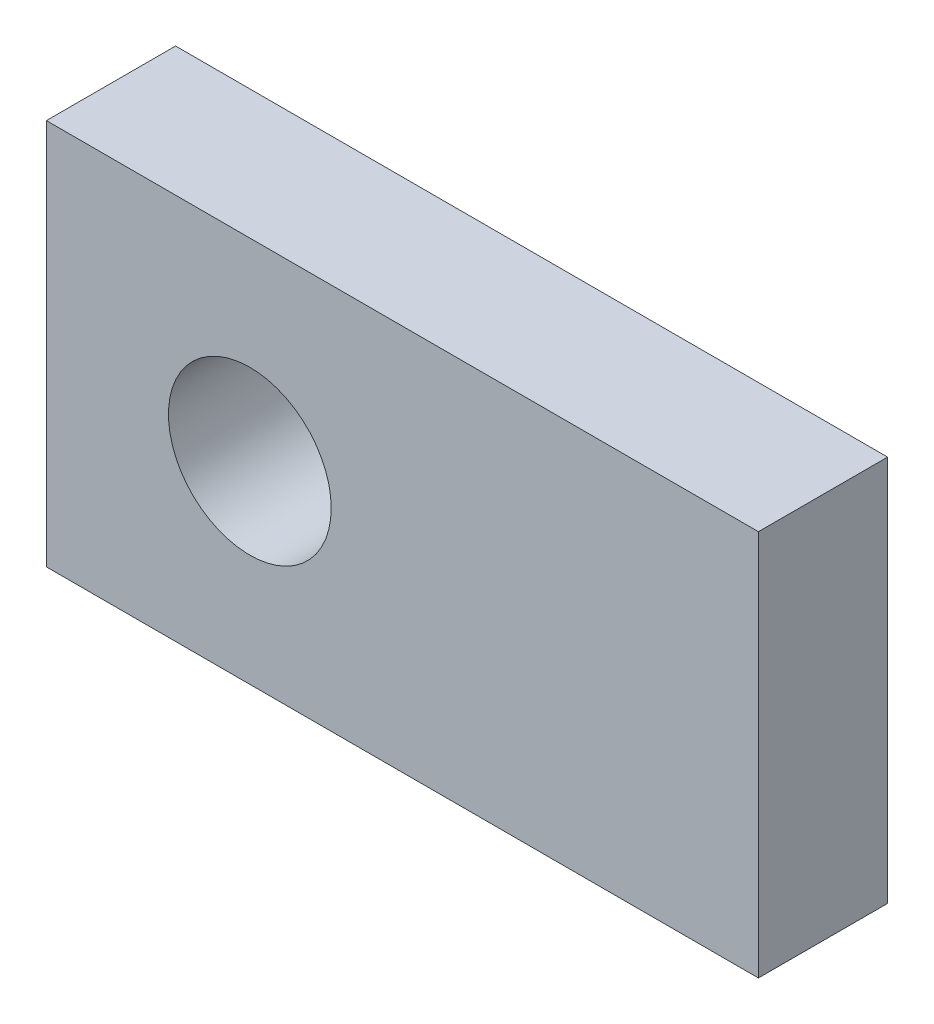
ISO-10303-21;
HEADER;
FILE_DESCRIPTION(('STEP AP214'),'2;1');
FILE_NAME('part.step','',(''),(''),'','','');
FILE_SCHEMA(('AUTOMOTIVE_DESIGN { 1 0 10303 214 1 1 1 1 }'));
ENDSEC;
DATA;
#1=APPLICATION_CONTEXT('core data for automotive mechanical design processes');
#2=APPLICATION_PROTOCOL_DEFINITION('international standard','automotive_design',2000,#1);
#3=PRODUCT_CONTEXT('',#1,'mechanical');
#4=PRODUCT('Part','Part','',(#3));
#5=PRODUCT_RELATED_PRODUCT_CATEGORY('part','',(#4));
#6=PRODUCT_DEFINITION_FORMATION('','',#4);
#7=PRODUCT_DEFINITION_CONTEXT('part definition',#1,'design');
#8=PRODUCT_DEFINITION('design','',#6,#7);
#9=PRODUCT_DEFINITION_SHAPE('','',#8);
#10=(LENGTH_UNIT() NAMED_UNIT(*) SI_UNIT(.MILLI.,.METRE.));
#11=(NAMED_UNIT(*) PLANE_ANGLE_UNIT() SI_UNIT($,.RADIAN.));
#12=(NAMED_UNIT(*) SI_UNIT($,.STERADIAN.) SOLID_ANGLE_UNIT());
#13=UNCERTAINTY_MEASURE_WITH_UNIT(LENGTH_MEASURE(1.E-05),#10,'distance_accuracy_value','');
#14=(GEOMETRIC_REPRESENTATION_CONTEXT(3) GLOBAL_UNCERTAINTY_ASSIGNED_CONTEXT((#13)) GLOBAL_UNIT_ASSIGNED_CONTEXT((#10,
#11,#12)) REPRESENTATION_CONTEXT('',''));
#15=CARTESIAN_POINT('',(0.,0.,0.));
#16=DIRECTION('',(0.,0.,1.));
#17=DIRECTION('',(1.,0.,0.));
#18=AXIS2_PLACEMENT_3D('',#15,#16,#17);
#19=CARTESIAN_POINT('',(0.,0.,6.35));
#20=DIRECTION('',(0.,0.,1.));
#21=DIRECTION('',(1.,0.,0.));
#22=AXIS2_PLACEMENT_3D('',#19,#20,#21);
#23=PLANE('',#22);
#24=DIRECTION('',(0.,-1.,0.));
#25=VECTOR('',#24,1.);
#26=CARTESIAN_POINT('',(-17.5,-9.5,6.35));
#27=LINE('',#26,#25);
#28=CARTESIAN_POINT('',(-17.5,9.5,6.35));
#29=VERTEX_POINT('',#28);
#30=CARTESIAN_POINT('',(-17.5,-9.5,6.35));
#31=VERTEX_POINT('',#30);
#32=EDGE_CURVE('E92',#29,#31,#27,.T.);
#33=ORIENTED_EDGE('',*,*,#32,.T.);
#34=DIRECTION('',(1.,0.,0.));
#35=VECTOR('',#34,1.);
#36=CARTESIAN_POINT('',(17.5,-9.5,6.35));
#37=LINE('',#36,#35);
#38=CARTESIAN_POINT('',(17.5,-9.5,6.35));
#39=VERTEX_POINT('',#38);
#40=EDGE_CURVE('E87',#31,#39,#37,.T.);
#41=ORIENTED_EDGE('',*,*,#40,.T.);
#42=DIRECTION('',(0.,1.,0.));
#43=VECTOR('',#42,1.);
#44=CARTESIAN_POINT('',(17.5,-9.5,6.35));
#45=LINE('',#44,#43);
#46=CARTESIAN_POINT('',(17.5,9.5,6.35));
#47=VERTEX_POINT('',#46);
#48=EDGE_CURVE('E90',#39,#47,#45,.T.);
#49=ORIENTED_EDGE('',*,*,#48,.T.);
#50=DIRECTION('',(-1.,0.,0.));
#51=VECTOR('',#50,1.);
#52=CARTESIAN_POINT('',(17.5,9.5,6.35));
#53=LINE('',#52,#51);
#54=EDGE_CURVE('E57',#47,#29,#53,.T.);
#55=ORIENTED_EDGE('',*,*,#54,.T.);
#56=EDGE_LOOP('',(#33,#41,#49,#55));
#57=FACE_BOUND('',#56,.T.);
#58=CARTESIAN_POINT('',(-7.5,0.,6.35));
#59=DIRECTION('',(0.,0.,1.));
#60=DIRECTION('',(1.,0.,0.));
#61=AXIS2_PLACEMENT_3D('',#58,#59,#60);
#62=CIRCLE('',#61,4.);
#63=CARTESIAN_POINT('',(-3.5,0.,6.35));
#64=VERTEX_POINT('',#63);
#65=EDGE_CURVE('E112',#64,#64,#62,.T.);
#66=ORIENTED_EDGE('',*,*,#65,.F.);
#67=EDGE_LOOP('',(#66));
#68=FACE_BOUND('',#67,.T.);
#69=ADVANCED_FACE('F39',(#57,#68),#23,.T.);
#70=CARTESIAN_POINT('',(0.,0.,0.));
#71=DIRECTION('',(0.,0.,1.));
#72=DIRECTION('',(1.,0.,0.));
#73=AXIS2_PLACEMENT_3D('',#70,#71,#72);
#74=PLANE('',#73);
#75=DIRECTION('',(0.,-1.,0.));
#76=VECTOR('',#75,1.);
#77=CARTESIAN_POINT('',(-17.5,-9.5,0.));
#78=LINE('',#77,#76);
#79=CARTESIAN_POINT('',(-17.5,9.5,0.));
#80=VERTEX_POINT('',#79);
#81=CARTESIAN_POINT('',(-17.5,-9.5,0.));
#82=VERTEX_POINT('',#81);
#83=EDGE_CURVE('E108',#80,#82,#78,.T.);
#84=ORIENTED_EDGE('',*,*,#83,.F.);
#85=DIRECTION('',(-1.,0.,0.));
#86=VECTOR('',#85,1.);
#87=CARTESIAN_POINT('',(17.5,9.5,0.));
#88=LINE('',#87,#86);
#89=CARTESIAN_POINT('',(17.5,9.5,0.));
#90=VERTEX_POINT('',#89);
#91=EDGE_CURVE('E80',#90,#80,#88,.T.);
#92=ORIENTED_EDGE('',*,*,#91,.F.);
#93=DIRECTION('',(0.,1.,0.));
#94=VECTOR('',#93,1.);
#95=CARTESIAN_POINT('',(17.5,-9.5,0.));
#96=LINE('',#95,#94);
#97=CARTESIAN_POINT('',(17.5,-9.5,0.));
#98=VERTEX_POINT('',#97);
#99=EDGE_CURVE('E74',#98,#90,#96,.T.);
#100=ORIENTED_EDGE('',*,*,#99,.F.);
#101=DIRECTION('',(1.,0.,0.));
#102=VECTOR('',#101,1.);
#103=CARTESIAN_POINT('',(17.5,-9.5,0.));
#104=LINE('',#103,#102);
#105=EDGE_CURVE('E97',#82,#98,#104,.T.);
#106=ORIENTED_EDGE('',*,*,#105,.F.);
#107=EDGE_LOOP('',(#84,#92,#100,#106));
#108=FACE_BOUND('',#107,.T.);
#109=CARTESIAN_POINT('',(-7.5,0.,0.));
#110=DIRECTION('',(0.,0.,1.));
#111=DIRECTION('',(1.,0.,0.));
#112=AXIS2_PLACEMENT_3D('',#109,#110,#111);
#113=CIRCLE('',#112,4.);
#114=CARTESIAN_POINT('',(-3.5,0.,0.));
#115=VERTEX_POINT('',#114);
#116=EDGE_CURVE('E130',#115,#115,#113,.T.);
#117=ORIENTED_EDGE('',*,*,#116,.T.);
#118=EDGE_LOOP('',(#117));
#119=FACE_BOUND('',#118,.T.);
#120=ADVANCED_FACE('F125',(#108,#119),#74,.F.);
#121=CARTESIAN_POINT('',(-17.5,-9.5,6.35));
#122=DIRECTION('',(1.,0.,0.));
#123=DIRECTION('',(0.,0.,-1.));
#124=AXIS2_PLACEMENT_3D('',#121,#122,#123);
#125=PLANE('',#124);
#126=ORIENTED_EDGE('',*,*,#83,.T.);
#127=DIRECTION('',(0.,0.,-1.));
#128=VECTOR('',#127,1.);
#129=CARTESIAN_POINT('',(-17.5,-9.5,6.35));
#130=LINE('',#129,#128);
#131=EDGE_CURVE('E11',#31,#82,#130,.T.);
#132=ORIENTED_EDGE('',*,*,#131,.F.);
#133=ORIENTED_EDGE('',*,*,#32,.F.);
#134=DIRECTION('',(0.,0.,-1.));
#135=VECTOR('',#134,1.);
#136=CARTESIAN_POINT('',(-17.5,9.5,6.35));
#137=LINE('',#136,#135);
#138=EDGE_CURVE('E104',#29,#80,#137,.T.);
#139=ORIENTED_EDGE('',*,*,#138,.T.);
#140=EDGE_LOOP('',(#126,#132,#133,#139));
#141=FACE_BOUND('',#140,.T.);
#142=ADVANCED_FACE('F41',(#141),#125,.F.);
#143=CARTESIAN_POINT('',(17.5,-9.5,6.35));
#144=DIRECTION('',(0.,1.,0.));
#145=DIRECTION('',(-1.,0.,0.));
#146=AXIS2_PLACEMENT_3D('',#143,#144,#145);
#147=PLANE('',#146);
#148=ORIENTED_EDGE('',*,*,#105,.T.);
#149=DIRECTION('',(0.,0.,-1.));
#150=VECTOR('',#149,1.);
#151=CARTESIAN_POINT('',(17.5,-9.5,6.35));
#152=LINE('',#151,#150);
#153=EDGE_CURVE('E49',#39,#98,#152,.T.);
#154=ORIENTED_EDGE('',*,*,#153,.F.);
#155=ORIENTED_EDGE('',*,*,#40,.F.);
#156=ORIENTED_EDGE('',*,*,#131,.T.);
#157=EDGE_LOOP('',(#148,#154,#155,#156));
#158=FACE_BOUND('',#157,.T.);
#159=ADVANCED_FACE('F96',(#158),#147,.F.);
#160=CARTESIAN_POINT('',(17.5,-9.5,6.35));
#161=DIRECTION('',(-1.,0.,0.));
#162=DIRECTION('',(0.,0.,1.));
#163=AXIS2_PLACEMENT_3D('',#160,#161,#162);
#164=PLANE('',#163);
#165=ORIENTED_EDGE('',*,*,#99,.T.);
#166=DIRECTION('',(0.,0.,-1.));
#167=VECTOR('',#166,1.);
#168=CARTESIAN_POINT('',(17.5,9.5,6.35));
#169=LINE('',#168,#167);
#170=EDGE_CURVE('E99',#47,#90,#169,.T.);
#171=ORIENTED_EDGE('',*,*,#170,.F.);
#172=ORIENTED_EDGE('',*,*,#48,.F.);
#173=ORIENTED_EDGE('',*,*,#153,.T.);
#174=EDGE_LOOP('',(#165,#171,#172,#173));
#175=FACE_BOUND('',#174,.T.);
#176=ADVANCED_FACE('F100',(#175),#164,.F.);
#177=CARTESIAN_POINT('',(17.5,9.5,6.35));
#178=DIRECTION('',(0.,-1.,0.));
#179=DIRECTION('',(1.,0.,0.));
#180=AXIS2_PLACEMENT_3D('',#177,#178,#179);
#181=PLANE('',#180);
#182=ORIENTED_EDGE('',*,*,#91,.T.);
#183=ORIENTED_EDGE('',*,*,#138,.F.);
#184=ORIENTED_EDGE('',*,*,#54,.F.);
#185=ORIENTED_EDGE('',*,*,#170,.T.);
#186=EDGE_LOOP('',(#182,#183,#184,#185));
#187=FACE_BOUND('',#186,.T.);
#188=ADVANCED_FACE('F122',(#187),#181,.F.);
#189=CARTESIAN_POINT('',(-7.5,0.,6.35));
#190=DIRECTION('',(0.,0.,-1.));
#191=DIRECTION('',(-1.,0.,0.));
#192=AXIS2_PLACEMENT_3D('',#189,#190,#191);
#193=CYLINDRICAL_SURFACE('',#192,4.);
#194=ORIENTED_EDGE('',*,*,#65,.T.);
#195=EDGE_LOOP('',(#194));
#196=FACE_BOUND('',#195,.T.);
#197=ORIENTED_EDGE('',*,*,#116,.F.);
#198=EDGE_LOOP('',(#197));
#199=FACE_BOUND('',#198,.T.);
#200=ADVANCED_FACE('F138',(#196,#199),#193,.F.);
#201=CLOSED_SHELL('',(#69,#120,#142,#159,#176,#188,#200));
#202=MANIFOLD_SOLID_BREP('B2',#201);
#203=ADVANCED_BREP_SHAPE_REPRESENTATION('',(#18,#202),#14);
#204=SHAPE_DEFINITION_REPRESENTATION(#9,#203);
ENDSEC;
END-ISO-10303-21;
